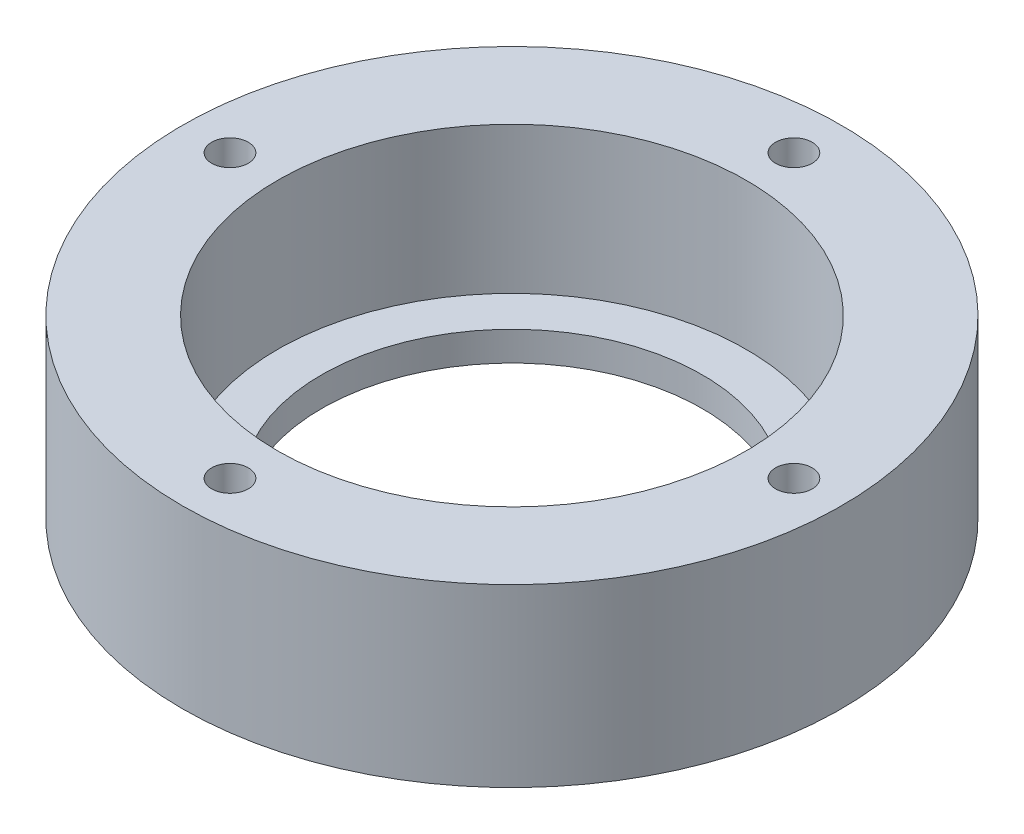
ISO-10303-21;
HEADER;
FILE_DESCRIPTION(('STEP AP214'),'2;1');
FILE_NAME('part.step','',(''),(''),'','','');
FILE_SCHEMA(('AUTOMOTIVE_DESIGN { 1 0 10303 214 1 1 1 1 }'));
ENDSEC;
DATA;
#1=APPLICATION_CONTEXT('core data for automotive mechanical design processes');
#2=APPLICATION_PROTOCOL_DEFINITION('international standard','automotive_design',2000,#1);
#3=PRODUCT_CONTEXT('',#1,'mechanical');
#4=PRODUCT('Part','Part','',(#3));
#5=PRODUCT_RELATED_PRODUCT_CATEGORY('part','',(#4));
#6=PRODUCT_DEFINITION_FORMATION('','',#4);
#7=PRODUCT_DEFINITION_CONTEXT('part definition',#1,'design');
#8=PRODUCT_DEFINITION('design','',#6,#7);
#9=PRODUCT_DEFINITION_SHAPE('','',#8);
#10=(LENGTH_UNIT() NAMED_UNIT(*) SI_UNIT(.MILLI.,.METRE.));
#11=(NAMED_UNIT(*) PLANE_ANGLE_UNIT() SI_UNIT($,.RADIAN.));
#12=(NAMED_UNIT(*) SI_UNIT($,.STERADIAN.) SOLID_ANGLE_UNIT());
#13=UNCERTAINTY_MEASURE_WITH_UNIT(LENGTH_MEASURE(1.E-05),#10,'distance_accuracy_value','');
#14=(GEOMETRIC_REPRESENTATION_CONTEXT(3) GLOBAL_UNCERTAINTY_ASSIGNED_CONTEXT((#13)) GLOBAL_UNIT_ASSIGNED_CONTEXT((#10,
#11,#12)) REPRESENTATION_CONTEXT('',''));
#15=CARTESIAN_POINT('',(0.,0.,0.));
#16=DIRECTION('',(0.,0.,1.));
#17=DIRECTION('',(1.,0.,0.));
#18=AXIS2_PLACEMENT_3D('',#15,#16,#17);
#19=CARTESIAN_POINT('',(0.,12.,0.));
#20=DIRECTION('',(0.,-1.,0.));
#21=DIRECTION('',(0.,0.,-1.));
#22=AXIS2_PLACEMENT_3D('',#19,#20,#21);
#23=CYLINDRICAL_SURFACE('',#22,22.5);
#24=CARTESIAN_POINT('',(0.,12.,0.));
#25=DIRECTION('',(0.,1.,0.));
#26=DIRECTION('',(0.,0.,1.));
#27=AXIS2_PLACEMENT_3D('',#24,#25,#26);
#28=CIRCLE('',#27,22.5);
#29=CARTESIAN_POINT('',(0.,12.,22.5));
#30=VERTEX_POINT('',#29);
#31=EDGE_CURVE('E11',#30,#30,#28,.T.);
#32=ORIENTED_EDGE('',*,*,#31,.F.);
#33=EDGE_LOOP('',(#32));
#34=FACE_BOUND('',#33,.T.);
#35=CARTESIAN_POINT('',(0.,0.,0.));
#36=DIRECTION('',(0.,1.,0.));
#37=DIRECTION('',(0.,0.,1.));
#38=AXIS2_PLACEMENT_3D('',#35,#36,#37);
#39=CIRCLE('',#38,22.5);
#40=CARTESIAN_POINT('',(0.,0.,22.5));
#41=VERTEX_POINT('',#40);
#42=EDGE_CURVE('E38',#41,#41,#39,.T.);
#43=ORIENTED_EDGE('',*,*,#42,.T.);
#44=EDGE_LOOP('',(#43));
#45=FACE_BOUND('',#44,.T.);
#46=ADVANCED_FACE('F35',(#34,#45),#23,.T.);
#47=CARTESIAN_POINT('',(0.,12.,0.));
#48=DIRECTION('',(0.,1.,0.));
#49=DIRECTION('',(0.,0.,1.));
#50=AXIS2_PLACEMENT_3D('',#47,#48,#49);
#51=PLANE('',#50);
#52=CARTESIAN_POINT('',(-19.25,12.,0.));
#53=DIRECTION('',(0.,1.,0.));
#54=DIRECTION('',(0.,0.,1.));
#55=AXIS2_PLACEMENT_3D('',#52,#53,#54);
#56=CIRCLE('',#55,1.25);
#57=CARTESIAN_POINT('',(-19.25,12.,1.25));
#58=VERTEX_POINT('',#57);
#59=EDGE_CURVE('E66',#58,#58,#56,.T.);
#60=ORIENTED_EDGE('',*,*,#59,.F.);
#61=EDGE_LOOP('',(#60));
#62=FACE_BOUND('',#61,.T.);
#63=CARTESIAN_POINT('',(0.,12.,19.25));
#64=DIRECTION('',(0.,1.,0.));
#65=DIRECTION('',(0.,0.,1.));
#66=AXIS2_PLACEMENT_3D('',#63,#64,#65);
#67=CIRCLE('',#66,1.25);
#68=CARTESIAN_POINT('',(0.,12.,20.5));
#69=VERTEX_POINT('',#68);
#70=EDGE_CURVE('E65',#69,#69,#67,.T.);
#71=ORIENTED_EDGE('',*,*,#70,.F.);
#72=EDGE_LOOP('',(#71));
#73=FACE_BOUND('',#72,.T.);
#74=CARTESIAN_POINT('',(19.25,12.,0.));
#75=DIRECTION('',(0.,1.,0.));
#76=DIRECTION('',(0.,0.,1.));
#77=AXIS2_PLACEMENT_3D('',#74,#75,#76);
#78=CIRCLE('',#77,1.25);
#79=CARTESIAN_POINT('',(19.25,12.,1.25));
#80=VERTEX_POINT('',#79);
#81=EDGE_CURVE('E76',#80,#80,#78,.T.);
#82=ORIENTED_EDGE('',*,*,#81,.F.);
#83=EDGE_LOOP('',(#82));
#84=FACE_BOUND('',#83,.T.);
#85=CARTESIAN_POINT('',(0.,12.,-19.25));
#86=DIRECTION('',(0.,1.,0.));
#87=DIRECTION('',(0.,0.,1.));
#88=AXIS2_PLACEMENT_3D('',#85,#86,#87);
#89=CIRCLE('',#88,1.25);
#90=CARTESIAN_POINT('',(0.,12.,-18.));
#91=VERTEX_POINT('',#90);
#92=EDGE_CURVE('E82',#91,#91,#89,.T.);
#93=ORIENTED_EDGE('',*,*,#92,.F.);
#94=EDGE_LOOP('',(#93));
#95=FACE_BOUND('',#94,.T.);
#96=CARTESIAN_POINT('',(0.,12.,0.));
#97=DIRECTION('',(0.,1.,0.));
#98=DIRECTION('',(0.,0.,1.));
#99=AXIS2_PLACEMENT_3D('',#96,#97,#98);
#100=CIRCLE('',#99,16.);
#101=CARTESIAN_POINT('',(0.,12.,16.));
#102=VERTEX_POINT('',#101);
#103=EDGE_CURVE('E92',#102,#102,#100,.T.);
#104=ORIENTED_EDGE('',*,*,#103,.F.);
#105=EDGE_LOOP('',(#104));
#106=FACE_BOUND('',#105,.T.);
#107=ORIENTED_EDGE('',*,*,#31,.T.);
#108=EDGE_LOOP('',(#107));
#109=FACE_BOUND('',#108,.T.);
#110=ADVANCED_FACE('F103',(#62,#73,#84,#95,#106,#109),#51,.T.);
#111=CARTESIAN_POINT('',(0.,0.,0.));
#112=DIRECTION('',(0.,1.,0.));
#113=DIRECTION('',(0.,0.,1.));
#114=AXIS2_PLACEMENT_3D('',#111,#112,#113);
#115=PLANE('',#114);
#116=CARTESIAN_POINT('',(0.,0.,0.));
#117=DIRECTION('',(0.,1.,0.));
#118=DIRECTION('',(0.,0.,1.));
#119=AXIS2_PLACEMENT_3D('',#116,#117,#118);
#120=CIRCLE('',#119,13.);
#121=CARTESIAN_POINT('',(0.,0.,13.));
#122=VERTEX_POINT('',#121);
#123=EDGE_CURVE('E89',#122,#122,#120,.T.);
#124=ORIENTED_EDGE('',*,*,#123,.T.);
#125=EDGE_LOOP('',(#124));
#126=FACE_BOUND('',#125,.T.);
#127=ORIENTED_EDGE('',*,*,#42,.F.);
#128=EDGE_LOOP('',(#127));
#129=FACE_BOUND('',#128,.T.);
#130=ADVANCED_FACE('F106',(#126,#129),#115,.F.);
#131=CARTESIAN_POINT('',(0.,2.,0.));
#132=DIRECTION('',(0.,1.,0.));
#133=DIRECTION('',(0.,0.,1.));
#134=AXIS2_PLACEMENT_3D('',#131,#132,#133);
#135=CYLINDRICAL_SURFACE('',#134,16.);
#136=CARTESIAN_POINT('',(0.,2.,0.));
#137=DIRECTION('',(0.,1.,0.));
#138=DIRECTION('',(0.,0.,1.));
#139=AXIS2_PLACEMENT_3D('',#136,#137,#138);
#140=CIRCLE('',#139,16.);
#141=CARTESIAN_POINT('',(0.,2.,16.));
#142=VERTEX_POINT('',#141);
#143=EDGE_CURVE('E95',#142,#142,#140,.T.);
#144=ORIENTED_EDGE('',*,*,#143,.F.);
#145=EDGE_LOOP('',(#144));
#146=FACE_BOUND('',#145,.T.);
#147=ORIENTED_EDGE('',*,*,#103,.T.);
#148=EDGE_LOOP('',(#147));
#149=FACE_BOUND('',#148,.T.);
#150=ADVANCED_FACE('F101',(#146,#149),#135,.F.);
#151=CARTESIAN_POINT('',(0.,2.,0.));
#152=DIRECTION('',(0.,1.,0.));
#153=DIRECTION('',(0.,0.,1.));
#154=AXIS2_PLACEMENT_3D('',#151,#152,#153);
#155=PLANE('',#154);
#156=CARTESIAN_POINT('',(0.,2.,0.));
#157=DIRECTION('',(0.,1.,0.));
#158=DIRECTION('',(0.,0.,1.));
#159=AXIS2_PLACEMENT_3D('',#156,#157,#158);
#160=CIRCLE('',#159,13.);
#161=CARTESIAN_POINT('',(0.,2.,13.));
#162=VERTEX_POINT('',#161);
#163=EDGE_CURVE('E88',#162,#162,#160,.T.);
#164=ORIENTED_EDGE('',*,*,#163,.F.);
#165=EDGE_LOOP('',(#164));
#166=FACE_BOUND('',#165,.T.);
#167=ORIENTED_EDGE('',*,*,#143,.T.);
#168=EDGE_LOOP('',(#167));
#169=FACE_BOUND('',#168,.T.);
#170=ADVANCED_FACE('F121',(#166,#169),#155,.T.);
#171=CARTESIAN_POINT('',(0.,0.,0.));
#172=DIRECTION('',(0.,1.,0.));
#173=DIRECTION('',(0.,0.,1.));
#174=AXIS2_PLACEMENT_3D('',#171,#172,#173);
#175=CYLINDRICAL_SURFACE('',#174,13.);
#176=ORIENTED_EDGE('',*,*,#123,.F.);
#177=EDGE_LOOP('',(#176));
#178=FACE_BOUND('',#177,.T.);
#179=ORIENTED_EDGE('',*,*,#163,.T.);
#180=EDGE_LOOP('',(#179));
#181=FACE_BOUND('',#180,.T.);
#182=ADVANCED_FACE('F127',(#178,#181),#175,.F.);
#183=CARTESIAN_POINT('',(0.,3.5,-19.25));
#184=DIRECTION('',(0.,1.,0.));
#185=DIRECTION('',(0.,0.,1.));
#186=AXIS2_PLACEMENT_3D('',#183,#184,#185);
#187=CONICAL_SURFACE('',#186,1.25,1.02974425867665);
#188=CARTESIAN_POINT('',(0.,2.74892422621555,-19.25));
#189=VERTEX_POINT('',#188);
#190=VERTEX_LOOP('',#189);
#191=FACE_BOUND('',#190,.T.);
#192=CARTESIAN_POINT('',(0.,3.5,-19.25));
#193=DIRECTION('',(0.,1.,0.));
#194=DIRECTION('',(0.,0.,1.));
#195=AXIS2_PLACEMENT_3D('',#192,#193,#194);
#196=CIRCLE('',#195,1.25);
#197=CARTESIAN_POINT('',(0.,3.5,-18.));
#198=VERTEX_POINT('',#197);
#199=EDGE_CURVE('E85',#198,#198,#196,.T.);
#200=ORIENTED_EDGE('',*,*,#199,.T.);
#201=EDGE_LOOP('',(#200));
#202=FACE_BOUND('',#201,.T.);
#203=ADVANCED_FACE('F131',(#191,#202),#187,.F.);
#204=CARTESIAN_POINT('',(0.,12.,-19.25));
#205=DIRECTION('',(0.,1.,0.));
#206=DIRECTION('',(0.,0.,1.));
#207=AXIS2_PLACEMENT_3D('',#204,#205,#206);
#208=CYLINDRICAL_SURFACE('',#207,1.25);
#209=ORIENTED_EDGE('',*,*,#199,.F.);
#210=EDGE_LOOP('',(#209));
#211=FACE_BOUND('',#210,.T.);
#212=ORIENTED_EDGE('',*,*,#92,.T.);
#213=EDGE_LOOP('',(#212));
#214=FACE_BOUND('',#213,.T.);
#215=ADVANCED_FACE('F135',(#211,#214),#208,.F.);
#216=CARTESIAN_POINT('',(19.25,3.5,0.));
#217=DIRECTION('',(0.,1.,0.));
#218=DIRECTION('',(0.,0.,1.));
#219=AXIS2_PLACEMENT_3D('',#216,#217,#218);
#220=CONICAL_SURFACE('',#219,1.25,1.02974425867665);
#221=CARTESIAN_POINT('',(19.25,2.74892422621555,0.));
#222=VERTEX_POINT('',#221);
#223=VERTEX_LOOP('',#222);
#224=FACE_BOUND('',#223,.T.);
#225=CARTESIAN_POINT('',(19.25,3.5,0.));
#226=DIRECTION('',(0.,1.,0.));
#227=DIRECTION('',(0.,0.,1.));
#228=AXIS2_PLACEMENT_3D('',#225,#226,#227);
#229=CIRCLE('',#228,1.25);
#230=CARTESIAN_POINT('',(19.25,3.5,1.25));
#231=VERTEX_POINT('',#230);
#232=EDGE_CURVE('E79',#231,#231,#229,.T.);
#233=ORIENTED_EDGE('',*,*,#232,.T.);
#234=EDGE_LOOP('',(#233));
#235=FACE_BOUND('',#234,.T.);
#236=ADVANCED_FACE('F138',(#224,#235),#220,.F.);
#237=CARTESIAN_POINT('',(19.25,12.,0.));
#238=DIRECTION('',(0.,1.,0.));
#239=DIRECTION('',(0.,0.,1.));
#240=AXIS2_PLACEMENT_3D('',#237,#238,#239);
#241=CYLINDRICAL_SURFACE('',#240,1.25);
#242=ORIENTED_EDGE('',*,*,#232,.F.);
#243=EDGE_LOOP('',(#242));
#244=FACE_BOUND('',#243,.T.);
#245=ORIENTED_EDGE('',*,*,#81,.T.);
#246=EDGE_LOOP('',(#245));
#247=FACE_BOUND('',#246,.T.);
#248=ADVANCED_FACE('F142',(#244,#247),#241,.F.);
#249=CARTESIAN_POINT('',(0.,3.5,19.25));
#250=DIRECTION('',(0.,1.,0.));
#251=DIRECTION('',(0.,0.,1.));
#252=AXIS2_PLACEMENT_3D('',#249,#250,#251);
#253=CONICAL_SURFACE('',#252,1.25,1.02974425867665);
#254=CARTESIAN_POINT('',(0.,2.74892422621555,19.25));
#255=VERTEX_POINT('',#254);
#256=VERTEX_LOOP('',#255);
#257=FACE_BOUND('',#256,.T.);
#258=CARTESIAN_POINT('',(0.,3.5,19.25));
#259=DIRECTION('',(0.,1.,0.));
#260=DIRECTION('',(0.,0.,1.));
#261=AXIS2_PLACEMENT_3D('',#258,#259,#260);
#262=CIRCLE('',#261,1.25);
#263=CARTESIAN_POINT('',(0.,3.5,20.5));
#264=VERTEX_POINT('',#263);
#265=EDGE_CURVE('E69',#264,#264,#262,.T.);
#266=ORIENTED_EDGE('',*,*,#265,.T.);
#267=EDGE_LOOP('',(#266));
#268=FACE_BOUND('',#267,.T.);
#269=ADVANCED_FACE('F145',(#257,#268),#253,.F.);
#270=CARTESIAN_POINT('',(0.,12.,19.25));
#271=DIRECTION('',(0.,1.,0.));
#272=DIRECTION('',(0.,0.,1.));
#273=AXIS2_PLACEMENT_3D('',#270,#271,#272);
#274=CYLINDRICAL_SURFACE('',#273,1.25);
#275=ORIENTED_EDGE('',*,*,#265,.F.);
#276=EDGE_LOOP('',(#275));
#277=FACE_BOUND('',#276,.T.);
#278=ORIENTED_EDGE('',*,*,#70,.T.);
#279=EDGE_LOOP('',(#278));
#280=FACE_BOUND('',#279,.T.);
#281=ADVANCED_FACE('F59',(#277,#280),#274,.F.);
#282=CARTESIAN_POINT('',(-19.25,3.5,0.));
#283=DIRECTION('',(0.,1.,0.));
#284=DIRECTION('',(0.,0.,1.));
#285=AXIS2_PLACEMENT_3D('',#282,#283,#284);
#286=CONICAL_SURFACE('',#285,1.25,1.02974425867665);
#287=CARTESIAN_POINT('',(-19.25,2.74892422621555,0.));
#288=VERTEX_POINT('',#287);
#289=VERTEX_LOOP('',#288);
#290=FACE_BOUND('',#289,.T.);
#291=CARTESIAN_POINT('',(-19.25,3.5,0.));
#292=DIRECTION('',(0.,1.,0.));
#293=DIRECTION('',(0.,0.,1.));
#294=AXIS2_PLACEMENT_3D('',#291,#292,#293);
#295=CIRCLE('',#294,1.25);
#296=CARTESIAN_POINT('',(-19.25,3.5,1.25));
#297=VERTEX_POINT('',#296);
#298=EDGE_CURVE('E63',#297,#297,#295,.T.);
#299=ORIENTED_EDGE('',*,*,#298,.T.);
#300=EDGE_LOOP('',(#299));
#301=FACE_BOUND('',#300,.T.);
#302=ADVANCED_FACE('F55',(#290,#301),#286,.F.);
#303=CARTESIAN_POINT('',(-19.25,12.,0.));
#304=DIRECTION('',(0.,1.,0.));
#305=DIRECTION('',(0.,0.,1.));
#306=AXIS2_PLACEMENT_3D('',#303,#304,#305);
#307=CYLINDRICAL_SURFACE('',#306,1.25);
#308=ORIENTED_EDGE('',*,*,#298,.F.);
#309=EDGE_LOOP('',(#308));
#310=FACE_BOUND('',#309,.T.);
#311=ORIENTED_EDGE('',*,*,#59,.T.);
#312=EDGE_LOOP('',(#311));
#313=FACE_BOUND('',#312,.T.);
#314=ADVANCED_FACE('F58',(#310,#313),#307,.F.);
#315=CLOSED_SHELL('',(#46,#110,#130,#150,#170,#182,#203,#215,#236,#248,#269,#281,#302,#314));
#316=MANIFOLD_SOLID_BREP('B2',#315);
#317=ADVANCED_BREP_SHAPE_REPRESENTATION('',(#18,#316),#14);
#318=SHAPE_DEFINITION_REPRESENTATION(#9,#317);
ENDSEC;
END-ISO-10303-21;
